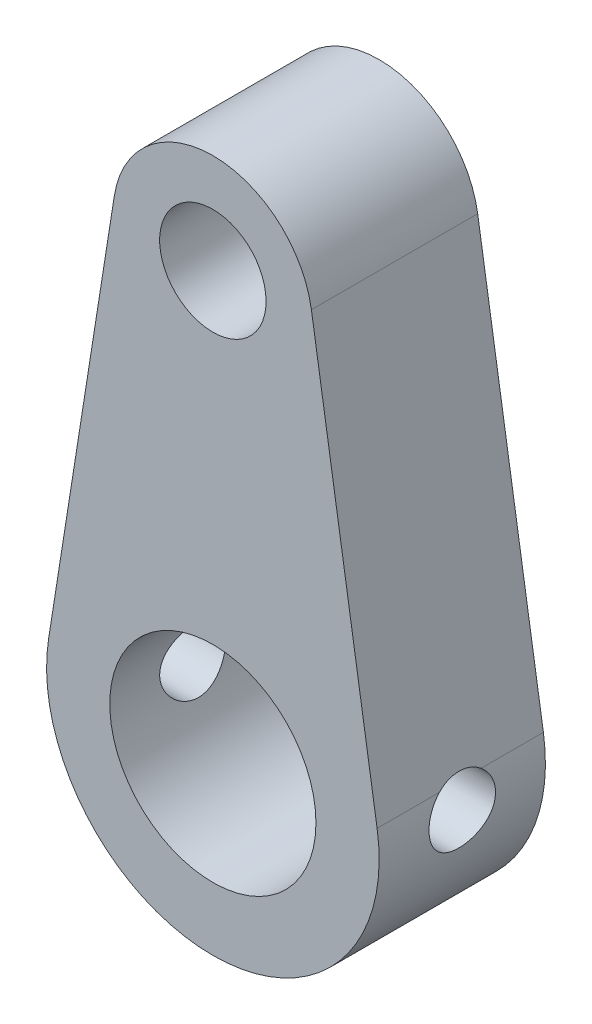
ISO-10303-21;
HEADER;
FILE_DESCRIPTION(('STEP AP214'),'2;1');
FILE_NAME('part.step','',(''),(''),'','','');
FILE_SCHEMA(('AUTOMOTIVE_DESIGN { 1 0 10303 214 1 1 1 1 }'));
ENDSEC;
DATA;
#1=APPLICATION_CONTEXT('core data for automotive mechanical design processes');
#2=APPLICATION_PROTOCOL_DEFINITION('international standard','automotive_design',2000,#1);
#3=PRODUCT_CONTEXT('',#1,'mechanical');
#4=PRODUCT('Part','Part','',(#3));
#5=PRODUCT_RELATED_PRODUCT_CATEGORY('part','',(#4));
#6=PRODUCT_DEFINITION_FORMATION('','',#4);
#7=PRODUCT_DEFINITION_CONTEXT('part definition',#1,'design');
#8=PRODUCT_DEFINITION('design','',#6,#7);
#9=PRODUCT_DEFINITION_SHAPE('','',#8);
#10=(LENGTH_UNIT() NAMED_UNIT(*) SI_UNIT(.MILLI.,.METRE.));
#11=(NAMED_UNIT(*) PLANE_ANGLE_UNIT() SI_UNIT($,.RADIAN.));
#12=(NAMED_UNIT(*) SI_UNIT($,.STERADIAN.) SOLID_ANGLE_UNIT());
#13=UNCERTAINTY_MEASURE_WITH_UNIT(LENGTH_MEASURE(1.E-05),#10,'distance_accuracy_value','');
#14=(GEOMETRIC_REPRESENTATION_CONTEXT(3) GLOBAL_UNCERTAINTY_ASSIGNED_CONTEXT((#13)) GLOBAL_UNIT_ASSIGNED_CONTEXT((#10,
#11,#12)) REPRESENTATION_CONTEXT('',''));
#15=CARTESIAN_POINT('',(0.,0.,0.));
#16=DIRECTION('',(0.,0.,1.));
#17=DIRECTION('',(1.,0.,0.));
#18=AXIS2_PLACEMENT_3D('',#15,#16,#17);
#19=CARTESIAN_POINT('',(0.,0.,5.));
#20=DIRECTION('',(0.,0.,1.));
#21=DIRECTION('',(1.,0.,0.));
#22=AXIS2_PLACEMENT_3D('',#19,#20,#21);
#23=PLANE('',#22);
#24=CARTESIAN_POINT('',(0.,0.,5.));
#25=DIRECTION('',(0.,0.,1.));
#26=DIRECTION('',(1.,0.,0.));
#27=AXIS2_PLACEMENT_3D('',#24,#25,#26);
#28=CIRCLE('',#27,3.1);
#29=CARTESIAN_POINT('',(3.1,0.,5.));
#30=VERTEX_POINT('',#29);
#31=EDGE_CURVE('E185',#30,#30,#28,.T.);
#32=ORIENTED_EDGE('',*,*,#31,.F.);
#33=EDGE_LOOP('',(#32));
#34=FACE_BOUND('',#33,.T.);
#35=CARTESIAN_POINT('',(0.,0.,5.));
#36=DIRECTION('',(0.,0.,1.));
#37=DIRECTION('',(1.,0.,0.));
#38=AXIS2_PLACEMENT_3D('',#35,#36,#37);
#39=CIRCLE('',#38,5.);
#40=CARTESIAN_POINT('',(-4.93887633308486,0.779423226812159,5.));
#41=VERTEX_POINT('',#40);
#42=CARTESIAN_POINT('',(4.93887633308486,0.779423226812159,5.));
#43=VERTEX_POINT('',#42);
#44=EDGE_CURVE('E189',#41,#43,#39,.T.);
#45=ORIENTED_EDGE('',*,*,#44,.T.);
#46=DIRECTION('',(-0.155884645362432,0.987775266616971,0.));
#47=VECTOR('',#46,1.);
#48=CARTESIAN_POINT('',(2.96332579985091,13.2976539360873,5.));
#49=LINE('',#48,#47);
#50=CARTESIAN_POINT('',(2.96332579985091,13.2976539360873,5.));
#51=VERTEX_POINT('',#50);
#52=EDGE_CURVE('E195',#43,#51,#49,.T.);
#53=ORIENTED_EDGE('',*,*,#52,.T.);
#54=CARTESIAN_POINT('',(0.,12.83,5.));
#55=DIRECTION('',(0.,0.,1.));
#56=DIRECTION('',(1.,0.,0.));
#57=AXIS2_PLACEMENT_3D('',#54,#55,#56);
#58=CIRCLE('',#57,3.);
#59=CARTESIAN_POINT('',(-2.96332579985091,13.2976539360873,5.));
#60=VERTEX_POINT('',#59);
#61=EDGE_CURVE('E135',#51,#60,#58,.T.);
#62=ORIENTED_EDGE('',*,*,#61,.T.);
#63=DIRECTION('',(-0.155884645362432,-0.987775266616971,0.));
#64=VECTOR('',#63,1.);
#65=CARTESIAN_POINT('',(-4.93887633308486,0.779423226812159,5.));
#66=LINE('',#65,#64);
#67=EDGE_CURVE('E130',#60,#41,#66,.T.);
#68=ORIENTED_EDGE('',*,*,#67,.T.);
#69=EDGE_LOOP('',(#45,#53,#62,#68));
#70=FACE_BOUND('',#69,.T.);
#71=CARTESIAN_POINT('',(0.,12.83,5.));
#72=DIRECTION('',(0.,0.,1.));
#73=DIRECTION('',(1.,0.,0.));
#74=AXIS2_PLACEMENT_3D('',#71,#72,#73);
#75=CIRCLE('',#74,1.6);
#76=CARTESIAN_POINT('',(1.6,12.83,5.));
#77=VERTEX_POINT('',#76);
#78=EDGE_CURVE('E173',#77,#77,#75,.T.);
#79=ORIENTED_EDGE('',*,*,#78,.F.);
#80=EDGE_LOOP('',(#79));
#81=FACE_BOUND('',#80,.T.);
#82=ADVANCED_FACE('F44',(#34,#70,#81),#23,.T.);
#83=CARTESIAN_POINT('',(0.,0.,0.));
#84=DIRECTION('',(0.,0.,1.));
#85=DIRECTION('',(1.,0.,0.));
#86=AXIS2_PLACEMENT_3D('',#83,#84,#85);
#87=PLANE('',#86);
#88=CARTESIAN_POINT('',(0.,0.,0.));
#89=DIRECTION('',(0.,0.,1.));
#90=DIRECTION('',(1.,0.,0.));
#91=AXIS2_PLACEMENT_3D('',#88,#89,#90);
#92=CIRCLE('',#91,5.);
#93=CARTESIAN_POINT('',(-4.93887633308486,0.779423226812159,0.));
#94=VERTEX_POINT('',#93);
#95=CARTESIAN_POINT('',(4.93887633308486,0.779423226812159,0.));
#96=VERTEX_POINT('',#95);
#97=EDGE_CURVE('E186',#94,#96,#92,.T.);
#98=ORIENTED_EDGE('',*,*,#97,.F.);
#99=DIRECTION('',(-0.155884645362432,-0.987775266616971,0.));
#100=VECTOR('',#99,1.);
#101=CARTESIAN_POINT('',(-4.93887633308486,0.779423226812159,0.));
#102=LINE('',#101,#100);
#103=CARTESIAN_POINT('',(-2.96332579985091,13.2976539360873,0.));
#104=VERTEX_POINT('',#103);
#105=EDGE_CURVE('E125',#104,#94,#102,.T.);
#106=ORIENTED_EDGE('',*,*,#105,.F.);
#107=CARTESIAN_POINT('',(0.,12.83,0.));
#108=DIRECTION('',(0.,0.,1.));
#109=DIRECTION('',(1.,0.,0.));
#110=AXIS2_PLACEMENT_3D('',#107,#108,#109);
#111=CIRCLE('',#110,3.);
#112=CARTESIAN_POINT('',(2.96332579985091,13.2976539360873,0.));
#113=VERTEX_POINT('',#112);
#114=EDGE_CURVE('E201',#113,#104,#111,.T.);
#115=ORIENTED_EDGE('',*,*,#114,.F.);
#116=DIRECTION('',(-0.155884645362432,0.987775266616971,0.));
#117=VECTOR('',#116,1.);
#118=CARTESIAN_POINT('',(2.96332579985091,13.2976539360873,0.));
#119=LINE('',#118,#117);
#120=EDGE_CURVE('E203',#96,#113,#119,.T.);
#121=ORIENTED_EDGE('',*,*,#120,.F.);
#122=EDGE_LOOP('',(#98,#106,#115,#121));
#123=FACE_BOUND('',#122,.T.);
#124=CARTESIAN_POINT('',(0.,0.,0.));
#125=DIRECTION('',(0.,0.,1.));
#126=DIRECTION('',(1.,0.,0.));
#127=AXIS2_PLACEMENT_3D('',#124,#125,#126);
#128=CIRCLE('',#127,3.1);
#129=CARTESIAN_POINT('',(3.1,0.,0.));
#130=VERTEX_POINT('',#129);
#131=EDGE_CURVE('E177',#130,#130,#128,.T.);
#132=ORIENTED_EDGE('',*,*,#131,.T.);
#133=EDGE_LOOP('',(#132));
#134=FACE_BOUND('',#133,.T.);
#135=CARTESIAN_POINT('',(0.,12.83,0.));
#136=DIRECTION('',(0.,0.,1.));
#137=DIRECTION('',(1.,0.,0.));
#138=AXIS2_PLACEMENT_3D('',#135,#136,#137);
#139=CIRCLE('',#138,1.6);
#140=CARTESIAN_POINT('',(1.6,12.83,0.));
#141=VERTEX_POINT('',#140);
#142=EDGE_CURVE('E172',#141,#141,#139,.T.);
#143=ORIENTED_EDGE('',*,*,#142,.T.);
#144=EDGE_LOOP('',(#143));
#145=FACE_BOUND('',#144,.T.);
#146=ADVANCED_FACE('F214',(#123,#134,#145),#87,.F.);
#147=CARTESIAN_POINT('',(0.,0.,5.));
#148=DIRECTION('',(0.,0.,-1.));
#149=DIRECTION('',(-1.,0.,0.));
#150=AXIS2_PLACEMENT_3D('',#147,#148,#149);
#151=CYLINDRICAL_SURFACE('',#150,5.);
#152=DIRECTION('',(0.,0.,-1.));
#153=VECTOR('',#152,1.);
#154=CARTESIAN_POINT('',(-4.93887633308486,0.779423226812159,5.));
#155=LINE('',#154,#153);
#156=CARTESIAN_POINT('',(-4.93887633308486,0.779423226812159,3.12649775219527));
#157=VERTEX_POINT('',#156);
#158=EDGE_CURVE('E115',#41,#157,#155,.T.);
#159=ORIENTED_EDGE('',*,*,#158,.T.);
#160=CARTESIAN_POINT('',(-4.93887633308486,0.779423226812159,3.12649775219527));
#161=CARTESIAN_POINT('',(-4.94444639141738,0.744190473981942,3.17039607514375));
#162=CARTESIAN_POINT('',(-4.95020368600045,0.705208646249002,3.21124545358706));
#163=CARTESIAN_POINT('',(-4.96147273159612,0.620940136341251,3.28586155894678));
#164=CARTESIAN_POINT('',(-4.96698448562455,0.575653531632072,3.31962837287258));
#165=CARTESIAN_POINT('',(-4.97714615720528,0.479934344141483,3.37911653016482));
#166=CARTESIAN_POINT('',(-4.98179546868652,0.429498180870362,3.40483222436718));
#167=CARTESIAN_POINT('',(-4.98970505964688,0.324940170946366,3.44741580871317));
#168=CARTESIAN_POINT('',(-4.99296598819927,0.270820060306364,3.46428783415352));
#169=CARTESIAN_POINT('',(-4.99770515667251,0.161025334542306,3.48853318057472));
#170=CARTESIAN_POINT('',(-4.99920214281826,0.105373619817025,3.49600644500633));
#171=CARTESIAN_POINT('',(-5.00030828330907,-0.00642293722879753,3.50154424580158));
#172=CARTESIAN_POINT('',(-4.99991723647759,-0.0625678314631006,3.49960777952515));
#173=CARTESIAN_POINT('',(-4.99730941583356,-0.172931197975182,3.48647902207586));
#174=CARTESIAN_POINT('',(-4.99511785819156,-0.227165551651902,3.47541455972476));
#175=CARTESIAN_POINT('',(-4.98918112635718,-0.332989594250659,3.44454018258334));
#176=CARTESIAN_POINT('',(-4.98543599256798,-0.384579351910333,3.42473049522535));
#177=CARTESIAN_POINT('',(-4.9767647245557,-0.484073072104414,3.37678084869572));
#178=CARTESIAN_POINT('',(-4.97183040687145,-0.531948315185433,3.34858283490489));
#179=CARTESIAN_POINT('',(-4.9613272155546,-0.622339192198998,3.28470230569577));
#180=CARTESIAN_POINT('',(-4.95575825536316,-0.66485409336542,3.24901876876837));
#181=CARTESIAN_POINT('',(-4.94448832308831,-0.744088156346989,3.17044684922842));
#182=CARTESIAN_POINT('',(-4.93878673470155,-0.780694235671535,3.12744442700732));
#183=CARTESIAN_POINT('',(-4.92798820702866,-0.846189979965816,3.03584734589846));
#184=CARTESIAN_POINT('',(-4.92289127179532,-0.875079593216219,2.98725264953179));
#185=CARTESIAN_POINT('',(-4.91388192613668,-0.92433505099964,2.8857347169718));
#186=CARTESIAN_POINT('',(-4.90997104642557,-0.944689893468223,2.83280599820101));
#187=CARTESIAN_POINT('',(-4.90380690137042,-0.976185531576844,2.72418376984689));
#188=CARTESIAN_POINT('',(-4.9015534190668,-0.987327533236278,2.66849062315686));
#189=CARTESIAN_POINT('',(-4.89899893257157,-0.999925243743636,2.55695861794613));
#190=CARTESIAN_POINT('',(-4.89866465093994,-1.00154605417341,2.50113914155489));
#191=CARTESIAN_POINT('',(-4.89989871472445,-0.995490745443258,2.39003061905662));
#192=CARTESIAN_POINT('',(-4.90146696322163,-0.987815099864712,2.3347415460743));
#193=CARTESIAN_POINT('',(-4.90629933872723,-0.963522958909247,2.22676100870971));
#194=CARTESIAN_POINT('',(-4.90954838139591,-0.946985943650276,2.17405093007192));
#195=CARTESIAN_POINT('',(-4.91736454086264,-0.905521120153921,2.07214698803165));
#196=CARTESIAN_POINT('',(-4.92193177161894,-0.880592586433135,2.02295342909361));
#197=CARTESIAN_POINT('',(-4.93194769562514,-0.822657107053469,1.92874268198079));
#198=CARTESIAN_POINT('',(-4.93740756094469,-0.78954462296934,1.88379160212211));
#199=CARTESIAN_POINT('',(-4.94855912605729,-0.716331422500301,1.80002553224469));
#200=CARTESIAN_POINT('',(-4.95425084645216,-0.676230084068125,1.76121108900803));
#201=CARTESIAN_POINT('',(-4.96532689012621,-0.589462544285145,1.69023383233842));
#202=CARTESIAN_POINT('',(-4.97070540109189,-0.542707784686857,1.65817822914919));
#203=CARTESIAN_POINT('',(-4.98045852681358,-0.444377054807589,1.60237831973104));
#204=CARTESIAN_POINT('',(-4.98483311764334,-0.392800969662071,1.57863421158135));
#205=CARTESIAN_POINT('',(-4.99214926947187,-0.285301723648045,1.53982977369451));
#206=CARTESIAN_POINT('',(-4.99506318868335,-0.229316357244003,1.52493602295267));
#207=CARTESIAN_POINT('',(-4.99898832336341,-0.115552277984463,1.50502194079004));
#208=CARTESIAN_POINT('',(-4.99999973421263,-0.0577737498996549,1.50000059550693));
#209=CARTESIAN_POINT('',(-5.00000025586782,0.0556175538492479,1.49999942671821));
#210=CARTESIAN_POINT('',(-4.99906343292196,0.111230679514803,1.50465183392507));
#211=CARTESIAN_POINT('',(-4.99542102176651,0.220854377351298,1.52311098077975));
#212=CARTESIAN_POINT('',(-4.99271550567229,0.274865014767051,1.53691734719115));
#213=CARTESIAN_POINT('',(-4.98583632172571,0.379736715584028,1.57324229613288));
#214=CARTESIAN_POINT('',(-4.9816632722158,0.430599094899666,1.59575720973159));
#215=CARTESIAN_POINT('',(-4.97230217569958,0.527822456507958,1.64884308327339));
#216=CARTESIAN_POINT('',(-4.96711442975163,0.574184767871687,1.67941165464381));
#217=CARTESIAN_POINT('',(-4.95797788993907,0.647586666931299,1.73705754296161));
#218=CARTESIAN_POINT('',(-4.95414725596005,0.6761432118378,1.7622506715775));
#219=CARTESIAN_POINT('',(-4.94647398536235,0.730163676780705,1.81567305289871));
#220=CARTESIAN_POINT('',(-4.94263137857316,0.755632572644166,1.84389727864072));
#221=CARTESIAN_POINT('',(-4.93887633308486,0.779423226812159,1.87350224780473));
#222=B_SPLINE_CURVE_WITH_KNOTS('',3,(#160,#161,#162,#163,#164,#165,#166,#167,#168,#169,#170,
#171,#172,#173,#174,#175,#176,#177,#178,#179,#180,#181,#182,#183,#184,#185,#186,#187,#188,#189,
#190,#191,#192,#193,#194,#195,#196,#197,#198,#199,#200,#201,#202,#203,#204,#205,#206,#207,#208,
#209,#210,#211,#212,#213,#214,#215,#216,#217,#218,#219,#220,#221),.UNSPECIFIED.,.F.,.F.,(4,2,2,
2,2,2,2,2,2,2,2,2,2,2,2,2,2,2,2,2,2,2,2,2,2,2,2,2,2,2,4),(0.,0.169477081648134,
0.338952081146353,0.50854572966622,0.678060005345512,0.845756044485988,1.01346995262412,
1.17887427929299,1.34427430463451,1.51084678575735,1.67744201293587,1.84692144460288,
2.01640201217111,2.18610038825608,2.3557765462269,2.52250155361012,2.68921806802166,
2.85446368878579,3.01972359942586,3.18723736106887,3.3547660399985,3.52477981667602,
3.69479764483964,3.8679217120564,4.04102799909406,4.20767372068358,4.37431264800748,
4.54088144629065,4.70740089871277,4.82198987486675,4.93639166143157),.UNSPECIFIED.);
#223=CARTESIAN_POINT('',(-4.93887633308486,0.779423226812159,1.87350224780473));
#224=VERTEX_POINT('',#223);
#225=EDGE_CURVE('E73',#157,#224,#222,.T.);
#226=ORIENTED_EDGE('',*,*,#225,.T.);
#227=EDGE_CURVE('E107',#224,#94,#155,.T.);
#228=ORIENTED_EDGE('',*,*,#227,.T.);
#229=ORIENTED_EDGE('',*,*,#97,.T.);
#230=DIRECTION('',(0.,0.,-1.));
#231=VECTOR('',#230,1.);
#232=CARTESIAN_POINT('',(4.93887633308486,0.779423226812159,5.));
#233=LINE('',#232,#231);
#234=CARTESIAN_POINT('',(4.93887633308486,0.779423226812159,1.87350224780473));
#235=VERTEX_POINT('',#234);
#236=EDGE_CURVE('E61',#235,#96,#233,.T.);
#237=ORIENTED_EDGE('',*,*,#236,.F.);
#238=CARTESIAN_POINT('',(4.93887633308486,0.77942322681216,1.87350224780473));
#239=CARTESIAN_POINT('',(4.94444338534555,0.744211317341665,1.82962791165589));
#240=CARTESIAN_POINT('',(4.95019746373778,0.705251677457304,1.78879883356753));
#241=CARTESIAN_POINT('',(4.96146676255425,0.62098819656774,1.71417486378062));
#242=CARTESIAN_POINT('',(4.96698172187595,0.575677638380513,1.68038751525563));
#243=CARTESIAN_POINT('',(4.97714979090191,0.479902044482434,1.62086248913667));
#244=CARTESIAN_POINT('',(4.98180214583409,0.429432554078451,1.59513184766796));
#245=CARTESIAN_POINT('',(4.98970965220176,0.324856865685829,1.5525594567719));
#246=CARTESIAN_POINT('',(4.99296742179267,0.270757704876968,1.53570103710693));
#247=CARTESIAN_POINT('',(4.99687524409337,0.180271030503555,1.51571504369507));
#248=CARTESIAN_POINT('',(4.99804152098193,0.144491000798125,1.50983131991463));
#249=CARTESIAN_POINT('',(4.99960439426909,0.0724793968228371,1.50197255128425));
#250=CARTESIAN_POINT('',(5.00000082721533,0.0362477283046385,1.49999833649484));
#251=CARTESIAN_POINT('',(4.99999873198821,-0.0555629773908425,1.50000254993358));
#252=CARTESIAN_POINT('',(4.99906402819104,-0.111163690202497,1.50464778918292));
#253=CARTESIAN_POINT('',(4.99542440516037,-0.220801630436332,1.52309486534408));
#254=CARTESIAN_POINT('',(4.99271763152796,-0.274837158031584,1.53690629450838));
#255=CARTESIAN_POINT('',(4.98583639477746,-0.379731055263706,1.573241737854));
#256=CARTESIAN_POINT('',(4.98166348949128,-0.430592729977681,1.59575650687401));
#257=CARTESIAN_POINT('',(4.97230374141206,-0.52781029869085,1.64883367360991));
#258=CARTESIAN_POINT('',(4.96711700655739,-0.574166671565545,1.6793952147383));
#259=CARTESIAN_POINT('',(4.95622166786223,-0.661693313881157,1.74813839693573));
#260=CARTESIAN_POINT('',(4.950507487523,-0.702793705487416,1.78640813617816));
#261=CARTESIAN_POINT('',(4.9392418366889,-0.778036570652932,1.86929216013843));
#262=CARTESIAN_POINT('',(4.93369037986643,-0.812178460970211,1.91390697615107));
#263=CARTESIAN_POINT('',(4.92332441913459,-0.872831744256904,2.0087161830331));
#264=CARTESIAN_POINT('',(4.91851707569571,-0.899270926740243,2.05895762208857));
#265=CARTESIAN_POINT('',(4.91026268211327,-0.943305659601358,2.16328179545223));
#266=CARTESIAN_POINT('',(4.90681549818152,-0.960902079818722,2.21736415134182));
#267=CARTESIAN_POINT('',(4.90172805202484,-0.986525302180276,2.32708437451867));
#268=CARTESIAN_POINT('',(4.90006470043302,-0.994674501060842,2.38269256575866));
#269=CARTESIAN_POINT('',(4.89866375070281,-1.00155212729532,2.49450984317023));
#270=CARTESIAN_POINT('',(4.89892595490702,-1.00028152158767,2.55071886707516));
#271=CARTESIAN_POINT('',(4.90132551208417,-0.988454570132113,2.66124681554408));
#272=CARTESIAN_POINT('',(4.90343453071889,-0.978038529749984,2.71558146025227));
#273=CARTESIAN_POINT('',(4.90924546531946,-0.948437865320499,2.82171612887225));
#274=CARTESIAN_POINT('',(4.9129474557588,-0.929252831308749,2.8735160341556));
#275=CARTESIAN_POINT('',(4.92155617312705,-0.882524848096141,2.97351512383853));
#276=CARTESIAN_POINT('',(4.92647087106034,-0.854926303046295,3.02168761454456));
#277=CARTESIAN_POINT('',(4.9369461571345,-0.792193768105028,3.1127706135933));
#278=CARTESIAN_POINT('',(4.94250682300834,-0.75705887089018,3.15568048737566));
#279=CARTESIAN_POINT('',(4.95377027326525,-0.679499514875427,3.23582983553046));
#280=CARTESIAN_POINT('',(4.95947381431396,-0.636955247208023,3.27295336330773));
#281=CARTESIAN_POINT('',(4.97028859716657,-0.546183989104046,3.33955448086007));
#282=CARTESIAN_POINT('',(4.97539984404666,-0.497957047377338,3.36903213616589));
#283=CARTESIAN_POINT('',(4.98446673746624,-0.397061206423973,3.41952659398478));
#284=CARTESIAN_POINT('',(4.9884206014776,-0.344385614750288,3.44053036417558));
#285=CARTESIAN_POINT('',(4.99471392170965,-0.236153008329836,3.4733596293176));
#286=CARTESIAN_POINT('',(4.99705345722986,-0.18059613526238,3.48518557510816));
#287=CARTESIAN_POINT('',(4.9998268519754,-0.069173689433776,3.49915711697205));
#288=CARTESIAN_POINT('',(5.00029181247989,-0.0133286821690455,3.50146071579729));
#289=CARTESIAN_POINT('',(4.99935025987835,0.0979361574294375,3.49674887663432));
#290=CARTESIAN_POINT('',(4.99794423514756,0.153356096919533,3.48973587052027));
#291=CARTESIAN_POINT('',(4.99343872346404,0.261694249885777,3.46672355234278));
#292=CARTESIAN_POINT('',(4.9903547826524,0.314630656414261,3.45080669821398));
#293=CARTESIAN_POINT('',(4.98283786637634,0.417099073129575,3.4105292754935));
#294=CARTESIAN_POINT('',(4.97840418903808,0.466629295606657,3.38616431289931));
#295=CARTESIAN_POINT('',(4.96829608618421,0.56446995452045,3.32755969716132));
#296=CARTESIAN_POINT('',(4.96255417944785,0.612419707525789,3.29272333255658));
#297=CARTESIAN_POINT('',(4.95371373130346,0.679138563750818,3.23460628547558));
#298=CARTESIAN_POINT('',(4.95072640891439,0.700526142298872,3.2142375002363));
#299=CARTESIAN_POINT('',(4.94476729935525,0.741418472043853,3.17169025016042));
#300=CARTESIAN_POINT('',(4.94179551138208,0.760923321504045,3.14951187988116));
#301=CARTESIAN_POINT('',(4.93887633308486,0.77942322681216,3.12649775219527));
#302=B_SPLINE_CURVE_WITH_KNOTS('',3,(#238,#239,#240,#241,#242,#243,#244,#245,#246,#247,#248,
#249,#250,#251,#252,#253,#254,#255,#256,#257,#258,#259,#260,#261,#262,#263,#264,#265,#266,#267,
#268,#269,#270,#271,#272,#273,#274,#275,#276,#277,#278,#279,#280,#281,#282,#283,#284,#285,#286,
#287,#288,#289,#290,#291,#292,#293,#294,#295,#296,#297,#298,#299,#300,#301),.UNSPECIFIED.,.F.,
.F.,(4,2,2,2,2,2,2,2,2,2,2,2,2,2,2,2,2,2,2,2,2,2,2,2,2,2,2,2,2,2,2,4),(0.,0.169385777032416,
0.338952079687371,0.508666058477548,0.67806000861055,0.786692783402003,0.895348620454116,
1.06190365989743,1.22863327160141,1.39518625857966,1.56172152297745,1.73028080905377,
1.89885421748977,2.06896053403824,2.23905011439263,2.406910504248,2.57475366355325,
2.74006597371204,2.90538601327484,3.0718230662109,3.23828016824751,3.40773295841521,
3.57718429619941,3.74689525544932,3.91659787751416,4.08347306232188,4.25030469696053,
4.41561630021745,4.58101401410209,4.7586355156248,4.84759410435601,4.9365480476536),.UNSPECIFIED.);
#303=CARTESIAN_POINT('',(4.93887633308486,0.779423226812159,3.12649775219527));
#304=VERTEX_POINT('',#303);
#305=EDGE_CURVE('E67',#235,#304,#302,.T.);
#306=ORIENTED_EDGE('',*,*,#305,.T.);
#307=EDGE_CURVE('E11',#43,#304,#233,.T.);
#308=ORIENTED_EDGE('',*,*,#307,.F.);
#309=ORIENTED_EDGE('',*,*,#44,.F.);
#310=EDGE_LOOP('',(#159,#226,#228,#229,#237,#306,#308,#309));
#311=FACE_BOUND('',#310,.T.);
#312=ADVANCED_FACE('F50',(#311),#151,.T.);
#313=CARTESIAN_POINT('',(2.96332579985091,13.2976539360873,5.));
#314=DIRECTION('',(-0.987775266616971,-0.155884645362432,0.));
#315=DIRECTION('',(0.155884645362432,-0.987775266616971,0.));
#316=AXIS2_PLACEMENT_3D('',#313,#314,#315);
#317=PLANE('',#316);
#318=ORIENTED_EDGE('',*,*,#307,.T.);
#319=CARTESIAN_POINT('',(5.06188013506805,0.,2.5));
#320=DIRECTION('',(-0.987775266616971,-0.155884645362432,0.));
#321=DIRECTION('',(0.155884645362432,-0.987775266616971,0.));
#322=AXIS2_PLACEMENT_3D('',#319,#320,#321);
#323=ELLIPSE('',#322,1.01237602701361,1.);
#324=EDGE_CURVE('E111',#304,#235,#323,.T.);
#325=ORIENTED_EDGE('',*,*,#324,.T.);
#326=ORIENTED_EDGE('',*,*,#236,.T.);
#327=ORIENTED_EDGE('',*,*,#120,.T.);
#328=DIRECTION('',(0.,0.,-1.));
#329=VECTOR('',#328,1.);
#330=CARTESIAN_POINT('',(2.96332579985091,13.2976539360873,5.));
#331=LINE('',#330,#329);
#332=EDGE_CURVE('E140',#51,#113,#331,.T.);
#333=ORIENTED_EDGE('',*,*,#332,.F.);
#334=ORIENTED_EDGE('',*,*,#52,.F.);
#335=EDGE_LOOP('',(#318,#325,#326,#327,#333,#334));
#336=FACE_BOUND('',#335,.T.);
#337=ADVANCED_FACE('F222',(#336),#317,.F.);
#338=CARTESIAN_POINT('',(0.,12.83,5.));
#339=DIRECTION('',(0.,0.,-1.));
#340=DIRECTION('',(-1.,0.,0.));
#341=AXIS2_PLACEMENT_3D('',#338,#339,#340);
#342=CYLINDRICAL_SURFACE('',#341,3.);
#343=ORIENTED_EDGE('',*,*,#114,.T.);
#344=DIRECTION('',(0.,0.,-1.));
#345=VECTOR('',#344,1.);
#346=CARTESIAN_POINT('',(-2.96332579985091,13.2976539360873,5.));
#347=LINE('',#346,#345);
#348=EDGE_CURVE('E131',#60,#104,#347,.T.);
#349=ORIENTED_EDGE('',*,*,#348,.F.);
#350=ORIENTED_EDGE('',*,*,#61,.F.);
#351=ORIENTED_EDGE('',*,*,#332,.T.);
#352=EDGE_LOOP('',(#343,#349,#350,#351));
#353=FACE_BOUND('',#352,.T.);
#354=ADVANCED_FACE('F207',(#353),#342,.T.);
#355=CARTESIAN_POINT('',(-4.93887633308486,0.779423226812159,5.));
#356=DIRECTION('',(0.987775266616971,-0.155884645362432,0.));
#357=DIRECTION('',(0.155884645362432,0.987775266616972,0.));
#358=AXIS2_PLACEMENT_3D('',#355,#356,#357);
#359=PLANE('',#358);
#360=ORIENTED_EDGE('',*,*,#227,.F.);
#361=CARTESIAN_POINT('',(-5.06188013506805,0.,2.5));
#362=DIRECTION('',(0.987775266616971,-0.155884645362432,0.));
#363=DIRECTION('',(0.155884645362432,0.987775266616972,0.));
#364=AXIS2_PLACEMENT_3D('',#361,#362,#363);
#365=ELLIPSE('',#364,1.01237602701361,1.);
#366=EDGE_CURVE('E113',#224,#157,#365,.T.);
#367=ORIENTED_EDGE('',*,*,#366,.T.);
#368=ORIENTED_EDGE('',*,*,#158,.F.);
#369=ORIENTED_EDGE('',*,*,#67,.F.);
#370=ORIENTED_EDGE('',*,*,#348,.T.);
#371=ORIENTED_EDGE('',*,*,#105,.T.);
#372=EDGE_LOOP('',(#360,#367,#368,#369,#370,#371));
#373=FACE_BOUND('',#372,.T.);
#374=ADVANCED_FACE('F123',(#373),#359,.F.);
#375=CARTESIAN_POINT('',(0.,0.,5.));
#376=DIRECTION('',(0.,0.,-1.));
#377=DIRECTION('',(-1.,0.,0.));
#378=AXIS2_PLACEMENT_3D('',#375,#376,#377);
#379=CYLINDRICAL_SURFACE('',#378,3.1);
#380=CARTESIAN_POINT('',(-3.1,0.,3.5));
#381=CARTESIAN_POINT('',(-3.09999991732933,-0.0546616928378486,3.4999999220244));
#382=CARTESIAN_POINT('',(-3.09854074383551,-0.109324626027906,3.49550346640278));
#383=CARTESIAN_POINT('',(-3.09286313233695,-0.217046394731189,3.47768733967546));
#384=CARTESIAN_POINT('',(-3.08864423243675,-0.270104960165797,3.46436619157606));
#385=CARTESIAN_POINT('',(-3.07790688090447,-0.373049270981989,3.42940059437505));
#386=CARTESIAN_POINT('',(-3.07139212676488,-0.422939966664652,3.40776952345547));
#387=CARTESIAN_POINT('',(-3.05673203907304,-0.518385805557842,3.35685672340504));
#388=CARTESIAN_POINT('',(-3.04858641694504,-0.56394017936532,3.32757364000014));
#389=CARTESIAN_POINT('',(-3.03122795920094,-0.650909161248699,3.26118172182863));
#390=CARTESIAN_POINT('',(-3.02199075558346,-0.692162305670849,3.22386778188202));
#391=CARTESIAN_POINT('',(-3.00362795341575,-0.767946996765761,3.14290975132731));
#392=CARTESIAN_POINT('',(-2.99450237775344,-0.802477185933582,3.09926438537053));
#393=CARTESIAN_POINT('',(-2.97713144725325,-0.86473316101155,3.00545810364635));
#394=CARTESIAN_POINT('',(-2.96891598960081,-0.892253350457055,2.95515467487142));
#395=CARTESIAN_POINT('',(-2.95466389720521,-0.938375319479868,2.85032572472668));
#396=CARTESIAN_POINT('',(-2.94862664562182,-0.956979624412886,2.79580140398039));
#397=CARTESIAN_POINT('',(-2.93967022252739,-0.98414378042732,2.68590732742383));
#398=CARTESIAN_POINT('',(-2.93665788132408,-0.993004620178442,2.63061978282441));
#399=CARTESIAN_POINT('',(-2.93381620930014,-1.00137095885894,2.51926701054254));
#400=CARTESIAN_POINT('',(-2.93398596783569,-1.00087913430537,2.46320200993948));
#401=CARTESIAN_POINT('',(-2.93740735589061,-0.990788697586253,2.35441188027401));
#402=CARTESIAN_POINT('',(-2.94052787811318,-0.981577483817593,2.30164599191764));
#403=CARTESIAN_POINT('',(-2.94928546572062,-0.954939694345887,2.19845279895776));
#404=CARTESIAN_POINT('',(-2.95492281459322,-0.937512193172747,2.14802575850151));
#405=CARTESIAN_POINT('',(-2.96817595683685,-0.894672560822168,2.0500392599599));
#406=CARTESIAN_POINT('',(-2.97582076641868,-0.869142073499801,2.00253564078958));
#407=CARTESIAN_POINT('',(-2.99221470175116,-0.81090335738701,1.91236189812341));
#408=CARTESIAN_POINT('',(-3.00096412964128,-0.778193162960507,1.86969310314947));
#409=CARTESIAN_POINT('',(-3.01910259490866,-0.704641818516097,1.78821630882476));
#410=CARTESIAN_POINT('',(-3.0285020322448,-0.663482313791421,1.74969745541926));
#411=CARTESIAN_POINT('',(-3.04650716560179,-0.575171490035371,1.68003608493673));
#412=CARTESIAN_POINT('',(-3.05511279482185,-0.528019667529111,1.64889418830244));
#413=CARTESIAN_POINT('',(-3.07066150642765,-0.428478812163016,1.59465744086114));
#414=CARTESIAN_POINT('',(-3.07758933782193,-0.37604745470778,1.57163559847724));
#415=CARTESIAN_POINT('',(-3.0888915225951,-0.267780008434752,1.53482639045741));
#416=CARTESIAN_POINT('',(-3.09326670428871,-0.211945030567732,1.52103602906435));
#417=CARTESIAN_POINT('',(-3.09883546017117,-0.100906527818241,1.50358315794135));
#418=CARTESIAN_POINT('',(-3.10015181896368,-0.0457705439581181,1.49952956516814));
#419=CARTESIAN_POINT('',(-3.09982018660884,0.0644019846639811,1.50055721927925));
#420=CARTESIAN_POINT('',(-3.09817266024525,0.119438543662588,1.50563703390178));
#421=CARTESIAN_POINT('',(-3.0921792527875,0.226314427335926,1.5244754132811));
#422=CARTESIAN_POINT('',(-3.08790685930159,0.278199907400527,1.53799777632602));
#423=CARTESIAN_POINT('',(-3.07716867368517,0.378948229242881,1.57304581158147));
#424=CARTESIAN_POINT('',(-3.07070260589543,0.427810690232291,1.59457248965462));
#425=CARTESIAN_POINT('',(-3.05603411703274,0.522504343922596,1.64562548497316));
#426=CARTESIAN_POINT('',(-3.04779185335867,0.568227367030882,1.6753406677613));
#427=CARTESIAN_POINT('',(-3.03050981454519,0.654167346628331,1.74170286885525));
#428=CARTESIAN_POINT('',(-3.02146981026828,0.69438271261595,1.77835188226725));
#429=CARTESIAN_POINT('',(-3.00312715409018,0.769937672744124,1.85938124752915));
#430=CARTESIAN_POINT('',(-2.99382961373558,0.804998301572614,1.9040234857309));
#431=CARTESIAN_POINT('',(-2.97642049261311,0.867160084432997,1.99875897334226));
#432=CARTESIAN_POINT('',(-2.96830890551494,0.894261280951088,2.04885219365343));
#433=CARTESIAN_POINT('',(-2.95427571684034,0.939584779805247,2.1530195807189));
#434=CARTESIAN_POINT('',(-2.94834741256436,0.95783431246789,2.20708094179586));
#435=CARTESIAN_POINT('',(-2.93941897363931,0.984897526937618,2.31774224623256));
#436=CARTESIAN_POINT('',(-2.93641762891512,0.993715108285294,2.37434113038817));
#437=CARTESIAN_POINT('',(-2.93381458815353,1.00137232277604,2.48553895185141));
#438=CARTESIAN_POINT('',(-2.93405610172574,1.00067211468476,2.54010290467727));
#439=CARTESIAN_POINT('',(-2.93752743878588,0.990434800076224,2.64829362936697));
#440=CARTESIAN_POINT('',(-2.94075710520667,0.98089815803097,2.70192045033859));
#441=CARTESIAN_POINT('',(-2.94972779399559,0.953575367433497,2.80583238116483));
#442=CARTESIAN_POINT('',(-2.95542613218533,0.935929134388619,2.85615824895085));
#443=CARTESIAN_POINT('',(-2.96867882268021,0.892999646243257,2.95317451079794));
#444=CARTESIAN_POINT('',(-2.976233569577,0.867714767236765,2.99986412916846));
#445=CARTESIAN_POINT('',(-2.99273704950311,0.809005559218575,3.09037149180946));
#446=CARTESIAN_POINT('',(-3.00173047270294,0.775288162939722,3.13399094946717));
#447=CARTESIAN_POINT('',(-3.01990141354045,0.701177016271899,3.21510155114981));
#448=CARTESIAN_POINT('',(-3.02907898111945,0.660781432603366,3.25259100674496));
#449=CARTESIAN_POINT('',(-3.04697636303769,0.572731312047684,3.32171838592172));
#450=CARTESIAN_POINT('',(-3.0556682369196,0.524869500277996,3.3531003814197));
#451=CARTESIAN_POINT('',(-3.07125043822646,0.424270928109888,3.40733491952482));
#452=CARTESIAN_POINT('',(-3.07814135769285,0.371535777497289,3.43019026622078));
#453=CARTESIAN_POINT('',(-3.08896778011839,0.266255500103289,3.46539312404397));
#454=CARTESIAN_POINT('',(-3.09306744505299,0.213924651837508,3.47833137754337));
#455=CARTESIAN_POINT('',(-3.09858327970547,0.107729361043748,3.4956338442161));
#456=CARTESIAN_POINT('',(-3.10000008146617,0.0538652827579419,3.50000007683951));
#457=CARTESIAN_POINT('',(-3.1,0.,3.5));
#458=B_SPLINE_CURVE_WITH_KNOTS('',3,(#380,#381,#382,#383,#384,#385,#386,#387,#388,#389,#390,
#391,#392,#393,#394,#395,#396,#397,#398,#399,#400,#401,#402,#403,#404,#405,#406,#407,#408,#409,
#410,#411,#412,#413,#414,#415,#416,#417,#418,#419,#420,#421,#422,#423,#424,#425,#426,#427,#428,
#429,#430,#431,#432,#433,#434,#435,#436,#437,#438,#439,#440,#441,#442,#443,#444,#445,#446,#447,
#448,#449,#450,#451,#452,#453,#454,#455,#456,#457),.UNSPECIFIED.,.T.,.F.,(4,2,2,2,2,2,2,2,2,2,2,
2,2,2,2,2,2,2,2,2,2,2,2,2,2,2,2,2,2,2,2,2,2,2,2,2,2,2,4),(0.,0.163786977571215,
0.327601375188353,0.491153145030707,0.654733880339087,0.823132982457991,0.991566052684571,
1.16448270045611,1.33735034192778,1.50471321360198,1.672028190599,1.83224194543619,
1.99247375081972,2.15516292888894,2.31789670313387,2.48855415146277,2.6592259479318,
2.83139534275185,3.00350883884293,3.16858437380869,3.33363402459453,3.4942610328502,
3.65490823313219,3.81962570567674,3.98439064549244,4.15614032639134,4.32788909050078,
4.49910609991183,4.67025229406716,4.83315473478929,4.99604861330971,5.15623187832754,
5.31644922082922,5.48328449671261,5.65016564808849,5.82298974464348,5.99575695575451,
6.15719562667168,6.31859626029482),.UNSPECIFIED.);
#459=CARTESIAN_POINT('',(-3.1,0.,3.5));
#460=VERTEX_POINT('',#459);
#461=EDGE_CURVE('E49',#460,#460,#458,.T.);
#462=ORIENTED_EDGE('',*,*,#461,.F.);
#463=EDGE_LOOP('',(#462));
#464=FACE_BOUND('',#463,.T.);
#465=CARTESIAN_POINT('',(3.1,0.,1.5));
#466=CARTESIAN_POINT('',(3.09999991732933,-0.0546616928378486,1.5000000779756));
#467=CARTESIAN_POINT('',(3.09854074383551,-0.109324626027906,1.50449653359722));
#468=CARTESIAN_POINT('',(3.09286313233695,-0.217046394731189,1.52231266032454));
#469=CARTESIAN_POINT('',(3.08864423243675,-0.270104960165797,1.53563380842394));
#470=CARTESIAN_POINT('',(3.07790688090447,-0.373049270981989,1.57059940562495));
#471=CARTESIAN_POINT('',(3.07139212676488,-0.422939966664652,1.59223047654453));
#472=CARTESIAN_POINT('',(3.05673203907304,-0.518385805557841,1.64314327659496));
#473=CARTESIAN_POINT('',(3.04858641694504,-0.56394017936532,1.67242635999986));
#474=CARTESIAN_POINT('',(3.03122795920094,-0.650909161248699,1.73881827817137));
#475=CARTESIAN_POINT('',(3.02199075558346,-0.692162305670849,1.77613221811798));
#476=CARTESIAN_POINT('',(3.00362795341575,-0.767946996765761,1.85709024867269));
#477=CARTESIAN_POINT('',(2.99450237775344,-0.802477185933582,1.90073561462947));
#478=CARTESIAN_POINT('',(2.97713144725325,-0.86473316101155,1.99454189635365));
#479=CARTESIAN_POINT('',(2.96891598960081,-0.892253350457055,2.04484532512858));
#480=CARTESIAN_POINT('',(2.95466389720521,-0.938375319479868,2.14967427527332));
#481=CARTESIAN_POINT('',(2.94862664562182,-0.956979624412886,2.20419859601961));
#482=CARTESIAN_POINT('',(2.93967022252739,-0.98414378042732,2.31409267257617));
#483=CARTESIAN_POINT('',(2.93665788132408,-0.993004620178442,2.36938021717559));
#484=CARTESIAN_POINT('',(2.93381620930014,-1.00137095885894,2.48073298945746));
#485=CARTESIAN_POINT('',(2.93398596783569,-1.00087913430537,2.53679799006052));
#486=CARTESIAN_POINT('',(2.93740735589061,-0.990788697586252,2.64558811972599));
#487=CARTESIAN_POINT('',(2.94052787811318,-0.981577483817593,2.69835400808236));
#488=CARTESIAN_POINT('',(2.94928546572062,-0.954939694345887,2.80154720104224));
#489=CARTESIAN_POINT('',(2.95492281459322,-0.937512193172747,2.85197424149849));
#490=CARTESIAN_POINT('',(2.96817595683685,-0.894672560822169,2.9499607400401));
#491=CARTESIAN_POINT('',(2.97582076641868,-0.869142073499801,2.99746435921042));
#492=CARTESIAN_POINT('',(2.99221470175116,-0.810903357387011,3.08763810187659));
#493=CARTESIAN_POINT('',(3.00096412964128,-0.778193162960507,3.13030689685053));
#494=CARTESIAN_POINT('',(3.01910259490866,-0.704641818516097,3.21178369117524));
#495=CARTESIAN_POINT('',(3.0285020322448,-0.663482313791421,3.25030254458074));
#496=CARTESIAN_POINT('',(3.04650716560179,-0.575171490035371,3.31996391506327));
#497=CARTESIAN_POINT('',(3.05511279482185,-0.528019667529111,3.35110581169756));
#498=CARTESIAN_POINT('',(3.07066150642765,-0.428478812163016,3.40534255913886));
#499=CARTESIAN_POINT('',(3.07758933782193,-0.37604745470778,3.42836440152276));
#500=CARTESIAN_POINT('',(3.0888915225951,-0.267780008434752,3.46517360954259));
#501=CARTESIAN_POINT('',(3.09326670428871,-0.211945030567732,3.47896397093565));
#502=CARTESIAN_POINT('',(3.09883546017117,-0.100906527818242,3.49641684205865));
#503=CARTESIAN_POINT('',(3.10015181896368,-0.0457705439581184,3.50047043483186));
#504=CARTESIAN_POINT('',(3.09982018660884,0.0644019846639808,3.49944278072075));
#505=CARTESIAN_POINT('',(3.09817266024525,0.119438543662588,3.49436296609822));
#506=CARTESIAN_POINT('',(3.0921792527875,0.226314427335925,3.4755245867189));
#507=CARTESIAN_POINT('',(3.08790685930159,0.278199907400527,3.46200222367398));
#508=CARTESIAN_POINT('',(3.07716867368517,0.378948229242881,3.42695418841853));
#509=CARTESIAN_POINT('',(3.07070260589543,0.427810690232291,3.40542751034538));
#510=CARTESIAN_POINT('',(3.05603411703274,0.522504343922595,3.35437451502684));
#511=CARTESIAN_POINT('',(3.04779185335867,0.568227367030881,3.3246593322387));
#512=CARTESIAN_POINT('',(3.03050981454519,0.654167346628331,3.25829713114475));
#513=CARTESIAN_POINT('',(3.02146981026828,0.69438271261595,3.22164811773275));
#514=CARTESIAN_POINT('',(3.00312715409018,0.769937672744124,3.14061875247085));
#515=CARTESIAN_POINT('',(2.99382961373558,0.804998301572614,3.0959765142691));
#516=CARTESIAN_POINT('',(2.97642049261311,0.867160084432997,3.00124102665774));
#517=CARTESIAN_POINT('',(2.96830890551494,0.894261280951088,2.95114780634657));
#518=CARTESIAN_POINT('',(2.95427571684034,0.939584779805247,2.8469804192811));
#519=CARTESIAN_POINT('',(2.94834741256436,0.95783431246789,2.79291905820414));
#520=CARTESIAN_POINT('',(2.93941897363931,0.984897526937618,2.68225775376744));
#521=CARTESIAN_POINT('',(2.93641762891512,0.993715108285294,2.62565886961183));
#522=CARTESIAN_POINT('',(2.93381458815353,1.00137232277604,2.51446104814859));
#523=CARTESIAN_POINT('',(2.93405610172574,1.00067211468476,2.45989709532273));
#524=CARTESIAN_POINT('',(2.93752743878588,0.990434800076224,2.35170637063303));
#525=CARTESIAN_POINT('',(2.94075710520667,0.98089815803097,2.29807954966141));
#526=CARTESIAN_POINT('',(2.94972779399559,0.953575367433497,2.19416761883517));
#527=CARTESIAN_POINT('',(2.95542613218533,0.935929134388619,2.14384175104915));
#528=CARTESIAN_POINT('',(2.96867882268021,0.892999646243258,2.04682548920206));
#529=CARTESIAN_POINT('',(2.976233569577,0.867714767236766,2.00013587083154));
#530=CARTESIAN_POINT('',(2.99273704950311,0.809005559218575,1.90962850819054));
#531=CARTESIAN_POINT('',(3.00173047270294,0.775288162939723,1.86600905053283));
#532=CARTESIAN_POINT('',(3.01990141354045,0.701177016271899,1.78489844885019));
#533=CARTESIAN_POINT('',(3.02907898111945,0.660781432603366,1.74740899325504));
#534=CARTESIAN_POINT('',(3.04697636303769,0.572731312047684,1.67828161407828));
#535=CARTESIAN_POINT('',(3.0556682369196,0.524869500277996,1.6468996185803));
#536=CARTESIAN_POINT('',(3.07125043822646,0.424270928109888,1.59266508047518));
#537=CARTESIAN_POINT('',(3.07814135769285,0.371535777497289,1.56980973377922));
#538=CARTESIAN_POINT('',(3.08896778011839,0.26625550010329,1.53460687595603));
#539=CARTESIAN_POINT('',(3.09306744505299,0.213924651837508,1.52166862245663));
#540=CARTESIAN_POINT('',(3.09858327970547,0.107729361043748,1.5043661557839));
#541=CARTESIAN_POINT('',(3.10000008146617,0.0538652827579419,1.49999992316049));
#542=CARTESIAN_POINT('',(3.1,0.,1.5));
#543=B_SPLINE_CURVE_WITH_KNOTS('',3,(#465,#466,#467,#468,#469,#470,#471,#472,#473,#474,#475,
#476,#477,#478,#479,#480,#481,#482,#483,#484,#485,#486,#487,#488,#489,#490,#491,#492,#493,#494,
#495,#496,#497,#498,#499,#500,#501,#502,#503,#504,#505,#506,#507,#508,#509,#510,#511,#512,#513,
#514,#515,#516,#517,#518,#519,#520,#521,#522,#523,#524,#525,#526,#527,#528,#529,#530,#531,#532,
#533,#534,#535,#536,#537,#538,#539,#540,#541,#542),.UNSPECIFIED.,.T.,.F.,(4,2,2,2,2,2,2,2,2,2,2,
2,2,2,2,2,2,2,2,2,2,2,2,2,2,2,2,2,2,2,2,2,2,2,2,2,2,2,4),(0.,0.163786977571214,
0.327601375188353,0.491153145030706,0.654733880339087,0.823132982457991,0.991566052684571,
1.16448270045611,1.33735034192778,1.50471321360198,1.672028190599,1.83224194543619,
1.99247375081972,2.15516292888894,2.31789670313387,2.48855415146277,2.6592259479318,
2.83139534275185,3.00350883884293,3.16858437380869,3.33363402459453,3.4942610328502,
3.65490823313219,3.81962570567674,3.98439064549243,4.15614032639134,4.32788909050078,
4.49910609991183,4.67025229406716,4.83315473478928,4.99604861330971,5.15623187832753,
5.31644922082922,5.4832844967126,5.65016564808849,5.82298974464348,5.99575695575451,
6.15719562667168,6.31859626029482),.UNSPECIFIED.);
#544=CARTESIAN_POINT('',(3.1,0.,1.5));
#545=VERTEX_POINT('',#544);
#546=EDGE_CURVE('E142',#545,#545,#543,.T.);
#547=ORIENTED_EDGE('',*,*,#546,.F.);
#548=EDGE_LOOP('',(#547));
#549=FACE_BOUND('',#548,.T.);
#550=ORIENTED_EDGE('',*,*,#31,.T.);
#551=EDGE_LOOP('',(#550));
#552=FACE_BOUND('',#551,.T.);
#553=ORIENTED_EDGE('',*,*,#131,.F.);
#554=EDGE_LOOP('',(#553));
#555=FACE_BOUND('',#554,.T.);
#556=ADVANCED_FACE('F146',(#464,#549,#552,#555),#379,.F.);
#557=CARTESIAN_POINT('',(0.,12.83,5.));
#558=DIRECTION('',(0.,0.,-1.));
#559=DIRECTION('',(-1.,0.,0.));
#560=AXIS2_PLACEMENT_3D('',#557,#558,#559);
#561=CYLINDRICAL_SURFACE('',#560,1.6);
#562=ORIENTED_EDGE('',*,*,#78,.T.);
#563=EDGE_LOOP('',(#562));
#564=FACE_BOUND('',#563,.T.);
#565=ORIENTED_EDGE('',*,*,#142,.F.);
#566=EDGE_LOOP('',(#565));
#567=FACE_BOUND('',#566,.T.);
#568=ADVANCED_FACE('F154',(#564,#567),#561,.F.);
#569=CARTESIAN_POINT('',(-5.,0.,2.5));
#570=DIRECTION('',(1.,0.,0.));
#571=DIRECTION('',(0.,0.,-1.));
#572=AXIS2_PLACEMENT_3D('',#569,#570,#571);
#573=CYLINDRICAL_SURFACE('',#572,1.);
#574=ORIENTED_EDGE('',*,*,#546,.T.);
#575=EDGE_LOOP('',(#574));
#576=FACE_BOUND('',#575,.T.);
#577=ORIENTED_EDGE('',*,*,#324,.F.);
#578=ORIENTED_EDGE('',*,*,#305,.F.);
#579=EDGE_LOOP('',(#577,#578));
#580=FACE_BOUND('',#579,.T.);
#581=ADVANCED_FACE('F155',(#576,#580),#573,.F.);
#582=ORIENTED_EDGE('',*,*,#461,.T.);
#583=EDGE_LOOP('',(#582));
#584=FACE_BOUND('',#583,.T.);
#585=ORIENTED_EDGE('',*,*,#366,.F.);
#586=ORIENTED_EDGE('',*,*,#225,.F.);
#587=EDGE_LOOP('',(#585,#586));
#588=FACE_BOUND('',#587,.T.);
#589=ADVANCED_FACE('F120',(#584,#588),#573,.F.);
#590=CLOSED_SHELL('',(#82,#146,#312,#337,#354,#374,#556,#568,#581,#589));
#591=MANIFOLD_SOLID_BREP('B2',#590);
#592=ADVANCED_BREP_SHAPE_REPRESENTATION('',(#18,#591),#14);
#593=SHAPE_DEFINITION_REPRESENTATION(#9,#592);
ENDSEC;
END-ISO-10303-21;
